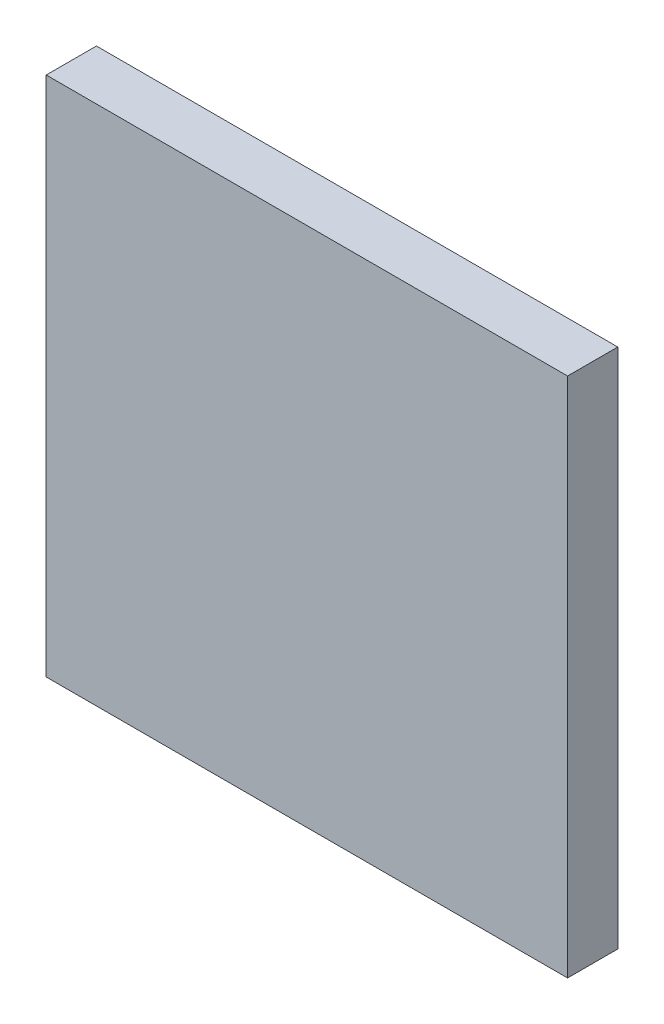
ISO-10303-21;
HEADER;
FILE_DESCRIPTION(('STEP AP214'),'2;1');
FILE_NAME('part.step','',(''),(''),'','','');
FILE_SCHEMA(('AUTOMOTIVE_DESIGN { 1 0 10303 214 1 1 1 1 }'));
ENDSEC;
DATA;
#1=APPLICATION_CONTEXT('core data for automotive mechanical design processes');
#2=APPLICATION_PROTOCOL_DEFINITION('international standard','automotive_design',2000,#1);
#3=PRODUCT_CONTEXT('',#1,'mechanical');
#4=PRODUCT('Part','Part','',(#3));
#5=PRODUCT_RELATED_PRODUCT_CATEGORY('part','',(#4));
#6=PRODUCT_DEFINITION_FORMATION('','',#4);
#7=PRODUCT_DEFINITION_CONTEXT('part definition',#1,'design');
#8=PRODUCT_DEFINITION('design','',#6,#7);
#9=PRODUCT_DEFINITION_SHAPE('','',#8);
#10=(LENGTH_UNIT() NAMED_UNIT(*) SI_UNIT(.MILLI.,.METRE.));
#11=(NAMED_UNIT(*) PLANE_ANGLE_UNIT() SI_UNIT($,.RADIAN.));
#12=(NAMED_UNIT(*) SI_UNIT($,.STERADIAN.) SOLID_ANGLE_UNIT());
#13=UNCERTAINTY_MEASURE_WITH_UNIT(LENGTH_MEASURE(1.E-05),#10,'distance_accuracy_value','');
#14=(GEOMETRIC_REPRESENTATION_CONTEXT(3) GLOBAL_UNCERTAINTY_ASSIGNED_CONTEXT((#13)) GLOBAL_UNIT_ASSIGNED_CONTEXT((#10,
#11,#12)) REPRESENTATION_CONTEXT('',''));
#15=CARTESIAN_POINT('',(0.,0.,0.));
#16=DIRECTION('',(0.,0.,1.));
#17=DIRECTION('',(1.,0.,0.));
#18=AXIS2_PLACEMENT_3D('',#15,#16,#17);
#19=CARTESIAN_POINT('',(45.00000249,73.50000187,-1.626522009273));
#20=DIRECTION('',(0.,0.,-1.));
#21=DIRECTION('',(-1.,0.,0.));
#22=AXIS2_PLACEMENT_3D('',#19,#20,#21);
#23=PLANE('',#22);
#24=DIRECTION('',(1.,0.,0.));
#25=VECTOR('',#24,1.);
#26=CARTESIAN_POINT('',(49.05000328,69.45000108,-1.626522009273));
#27=LINE('',#26,#25);
#28=CARTESIAN_POINT('',(49.05000328,69.45000108,-1.626522009273));
#29=VERTEX_POINT('',#28);
#30=CARTESIAN_POINT('',(40.9500017,69.45000108,-1.626522009273));
#31=VERTEX_POINT('',#30);
#32=EDGE_CURVE('E68',#29,#31,#27,.F.);
#33=ORIENTED_EDGE('',*,*,#32,.F.);
#34=DIRECTION('',(0.,1.,0.));
#35=VECTOR('',#34,1.);
#36=CARTESIAN_POINT('',(49.05000328,77.55000266,-1.626522009273));
#37=LINE('',#36,#35);
#38=CARTESIAN_POINT('',(49.05000328,77.55000266,-1.626522009273));
#39=VERTEX_POINT('',#38);
#40=EDGE_CURVE('E55',#39,#29,#37,.F.);
#41=ORIENTED_EDGE('',*,*,#40,.F.);
#42=DIRECTION('',(1.,0.,0.));
#43=VECTOR('',#42,1.);
#44=CARTESIAN_POINT('',(40.9500017,77.55000266,-1.626522009273));
#45=LINE('',#44,#43);
#46=CARTESIAN_POINT('',(40.9500017,77.55000266,-1.626522009273));
#47=VERTEX_POINT('',#46);
#48=EDGE_CURVE('E20',#47,#39,#45,.T.);
#49=ORIENTED_EDGE('',*,*,#48,.F.);
#50=DIRECTION('',(0.,1.,0.));
#51=VECTOR('',#50,1.);
#52=CARTESIAN_POINT('',(40.9500017,69.45000108,-1.626522009273));
#53=LINE('',#52,#51);
#54=EDGE_CURVE('E80',#31,#47,#53,.T.);
#55=ORIENTED_EDGE('',*,*,#54,.F.);
#56=EDGE_LOOP('',(#33,#41,#49,#55));
#57=FACE_BOUND('',#56,.T.);
#58=ADVANCED_FACE('F17',(#57),#23,.F.);
#59=CARTESIAN_POINT('',(40.9500017,77.55000266,-2.406522989273));
#60=DIRECTION('',(0.,1.,0.));
#61=DIRECTION('',(0.,0.,1.));
#62=AXIS2_PLACEMENT_3D('',#59,#60,#61);
#63=PLANE('',#62);
#64=DIRECTION('',(0.,0.,-1.));
#65=VECTOR('',#64,1.);
#66=CARTESIAN_POINT('',(49.05000328,77.55000266,-2.406522989273));
#67=LINE('',#66,#65);
#68=CARTESIAN_POINT('',(49.05000328,77.55000266,-2.406522989273));
#69=VERTEX_POINT('',#68);
#70=EDGE_CURVE('E61',#69,#39,#67,.F.);
#71=ORIENTED_EDGE('',*,*,#70,.F.);
#72=DIRECTION('',(-1.,0.,0.));
#73=VECTOR('',#72,1.);
#74=CARTESIAN_POINT('',(45.00000249,77.55000266,-2.406522989273));
#75=LINE('',#74,#73);
#76=CARTESIAN_POINT('',(40.9500017,77.55000266,-2.406522989273));
#77=VERTEX_POINT('',#76);
#78=EDGE_CURVE('E83',#77,#69,#75,.F.);
#79=ORIENTED_EDGE('',*,*,#78,.F.);
#80=DIRECTION('',(0.,0.,1.));
#81=VECTOR('',#80,1.);
#82=CARTESIAN_POINT('',(40.9500017,77.55000266,-2.406522989273));
#83=LINE('',#82,#81);
#84=EDGE_CURVE('E64',#47,#77,#83,.F.);
#85=ORIENTED_EDGE('',*,*,#84,.F.);
#86=ORIENTED_EDGE('',*,*,#48,.T.);
#87=EDGE_LOOP('',(#71,#79,#85,#86));
#88=FACE_BOUND('',#87,.T.);
#89=ADVANCED_FACE('F60',(#88),#63,.T.);
#90=CARTESIAN_POINT('',(49.05000328,77.55000266,-2.406522989273));
#91=DIRECTION('',(1.,0.,0.));
#92=DIRECTION('',(0.,0.,-1.));
#93=AXIS2_PLACEMENT_3D('',#90,#91,#92);
#94=PLANE('',#93);
#95=DIRECTION('',(0.,0.,-1.));
#96=VECTOR('',#95,1.);
#97=CARTESIAN_POINT('',(49.05000328,69.45000108,-2.406522989273));
#98=LINE('',#97,#96);
#99=CARTESIAN_POINT('',(49.05000328,69.45000108,-2.406522989273));
#100=VERTEX_POINT('',#99);
#101=EDGE_CURVE('E70',#100,#29,#98,.F.);
#102=ORIENTED_EDGE('',*,*,#101,.F.);
#103=DIRECTION('',(0.,1.,0.));
#104=VECTOR('',#103,1.);
#105=CARTESIAN_POINT('',(49.05000328,73.50000187,-2.406522989273));
#106=LINE('',#105,#104);
#107=EDGE_CURVE('E74',#69,#100,#106,.F.);
#108=ORIENTED_EDGE('',*,*,#107,.F.);
#109=ORIENTED_EDGE('',*,*,#70,.T.);
#110=ORIENTED_EDGE('',*,*,#40,.T.);
#111=EDGE_LOOP('',(#102,#108,#109,#110));
#112=FACE_BOUND('',#111,.T.);
#113=ADVANCED_FACE('F72',(#112),#94,.T.);
#114=CARTESIAN_POINT('',(49.05000328,69.45000108,-2.406522989273));
#115=DIRECTION('',(0.,-1.,0.));
#116=DIRECTION('',(0.,0.,-1.));
#117=AXIS2_PLACEMENT_3D('',#114,#115,#116);
#118=PLANE('',#117);
#119=DIRECTION('',(0.,0.,1.));
#120=VECTOR('',#119,1.);
#121=CARTESIAN_POINT('',(40.9500017,69.45000108,-2.406522989273));
#122=LINE('',#121,#120);
#123=CARTESIAN_POINT('',(40.9500017,69.45000108,-2.406522989273));
#124=VERTEX_POINT('',#123);
#125=EDGE_CURVE('E35',#124,#31,#122,.T.);
#126=ORIENTED_EDGE('',*,*,#125,.F.);
#127=DIRECTION('',(-1.,0.,0.));
#128=VECTOR('',#127,1.);
#129=CARTESIAN_POINT('',(45.00000249,69.45000108,-2.406522989273));
#130=LINE('',#129,#128);
#131=EDGE_CURVE('E26',#100,#124,#130,.T.);
#132=ORIENTED_EDGE('',*,*,#131,.F.);
#133=ORIENTED_EDGE('',*,*,#101,.T.);
#134=ORIENTED_EDGE('',*,*,#32,.T.);
#135=EDGE_LOOP('',(#126,#132,#133,#134));
#136=FACE_BOUND('',#135,.T.);
#137=ADVANCED_FACE('F89',(#136),#118,.T.);
#138=CARTESIAN_POINT('',(40.9500017,69.45000108,-2.406522989273));
#139=DIRECTION('',(-1.,0.,0.));
#140=DIRECTION('',(0.,0.,1.));
#141=AXIS2_PLACEMENT_3D('',#138,#139,#140);
#142=PLANE('',#141);
#143=ORIENTED_EDGE('',*,*,#84,.T.);
#144=DIRECTION('',(0.,1.,0.));
#145=VECTOR('',#144,1.);
#146=CARTESIAN_POINT('',(40.9500017,73.50000187,-2.406522989273));
#147=LINE('',#146,#145);
#148=EDGE_CURVE('E11',#124,#77,#147,.T.);
#149=ORIENTED_EDGE('',*,*,#148,.F.);
#150=ORIENTED_EDGE('',*,*,#125,.T.);
#151=ORIENTED_EDGE('',*,*,#54,.T.);
#152=EDGE_LOOP('',(#143,#149,#150,#151));
#153=FACE_BOUND('',#152,.T.);
#154=ADVANCED_FACE('F91',(#153),#142,.T.);
#155=CARTESIAN_POINT('',(45.00000249,73.50000187,-2.406522989273));
#156=DIRECTION('',(0.,0.,-1.));
#157=DIRECTION('',(-1.,0.,0.));
#158=AXIS2_PLACEMENT_3D('',#155,#156,#157);
#159=PLANE('',#158);
#160=ORIENTED_EDGE('',*,*,#131,.T.);
#161=ORIENTED_EDGE('',*,*,#148,.T.);
#162=ORIENTED_EDGE('',*,*,#78,.T.);
#163=ORIENTED_EDGE('',*,*,#107,.T.);
#164=EDGE_LOOP('',(#160,#161,#162,#163));
#165=FACE_BOUND('',#164,.T.);
#166=ADVANCED_FACE('F88',(#165),#159,.T.);
#167=CLOSED_SHELL('',(#58,#89,#113,#137,#154,#166));
#168=MANIFOLD_SOLID_BREP('B1',#167);
#169=ADVANCED_BREP_SHAPE_REPRESENTATION('',(#18,#168),#14);
#170=SHAPE_DEFINITION_REPRESENTATION(#9,#169);
ENDSEC;
END-ISO-10303-21;
